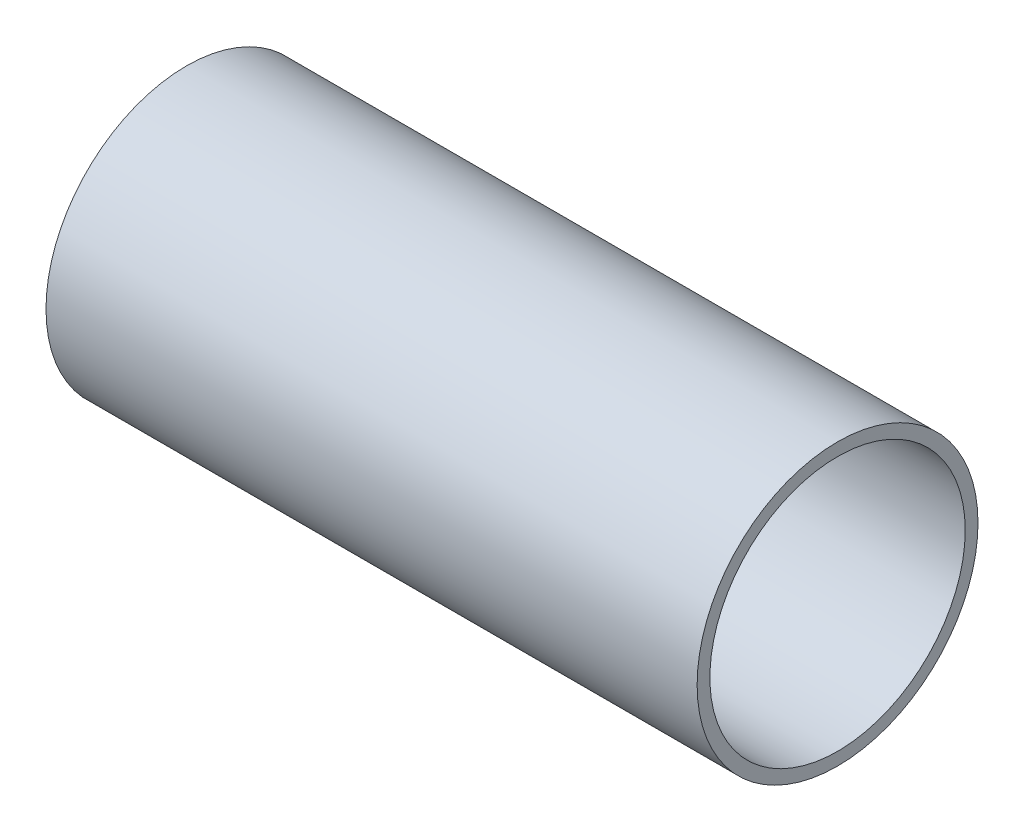
ISO-10303-21;
HEADER;
FILE_DESCRIPTION(('STEP AP214'),'2;1');
FILE_NAME('part.step','',(''),(''),'','','');
FILE_SCHEMA(('AUTOMOTIVE_DESIGN { 1 0 10303 214 1 1 1 1 }'));
ENDSEC;
DATA;
#1=APPLICATION_CONTEXT('core data for automotive mechanical design processes');
#2=APPLICATION_PROTOCOL_DEFINITION('international standard','automotive_design',2000,#1);
#3=PRODUCT_CONTEXT('',#1,'mechanical');
#4=PRODUCT('Part','Part','',(#3));
#5=PRODUCT_RELATED_PRODUCT_CATEGORY('part','',(#4));
#6=PRODUCT_DEFINITION_FORMATION('','',#4);
#7=PRODUCT_DEFINITION_CONTEXT('part definition',#1,'design');
#8=PRODUCT_DEFINITION('design','',#6,#7);
#9=PRODUCT_DEFINITION_SHAPE('','',#8);
#10=(LENGTH_UNIT() NAMED_UNIT(*) SI_UNIT(.MILLI.,.METRE.));
#11=(NAMED_UNIT(*) PLANE_ANGLE_UNIT() SI_UNIT($,.RADIAN.));
#12=(NAMED_UNIT(*) SI_UNIT($,.STERADIAN.) SOLID_ANGLE_UNIT());
#13=UNCERTAINTY_MEASURE_WITH_UNIT(LENGTH_MEASURE(1.E-05),#10,'distance_accuracy_value','');
#14=(GEOMETRIC_REPRESENTATION_CONTEXT(3) GLOBAL_UNCERTAINTY_ASSIGNED_CONTEXT((#13)) GLOBAL_UNIT_ASSIGNED_CONTEXT((#10,
#11,#12)) REPRESENTATION_CONTEXT('',''));
#15=CARTESIAN_POINT('',(0.,0.,0.));
#16=DIRECTION('',(0.,0.,1.));
#17=DIRECTION('',(1.,0.,0.));
#18=AXIS2_PLACEMENT_3D('',#15,#16,#17);
#19=CARTESIAN_POINT('',(102.,0.,0.));
#20=DIRECTION('',(1.,0.,0.));
#21=DIRECTION('',(0.,0.,-1.));
#22=AXIS2_PLACEMENT_3D('',#19,#20,#21);
#23=PLANE('',#22);
#24=CARTESIAN_POINT('',(102.,0.,0.));
#25=DIRECTION('',(1.,0.,0.));
#26=DIRECTION('',(0.,0.,-1.));
#27=AXIS2_PLACEMENT_3D('',#24,#25,#26);
#28=CIRCLE('',#27,22.);
#29=CARTESIAN_POINT('',(102.,0.,-22.));
#30=VERTEX_POINT('',#29);
#31=EDGE_CURVE('E10',#30,#30,#28,.T.);
#32=ORIENTED_EDGE('',*,*,#31,.T.);
#33=EDGE_LOOP('',(#32));
#34=FACE_BOUND('',#33,.T.);
#35=CARTESIAN_POINT('',(102.,0.,0.));
#36=DIRECTION('',(1.,0.,0.));
#37=DIRECTION('',(0.,0.,-1.));
#38=AXIS2_PLACEMENT_3D('',#35,#36,#37);
#39=CIRCLE('',#38,20.);
#40=CARTESIAN_POINT('',(102.,0.,-20.));
#41=VERTEX_POINT('',#40);
#42=EDGE_CURVE('E46',#41,#41,#39,.T.);
#43=ORIENTED_EDGE('',*,*,#42,.F.);
#44=EDGE_LOOP('',(#43));
#45=FACE_BOUND('',#44,.T.);
#46=ADVANCED_FACE('F35',(#34,#45),#23,.T.);
#47=CARTESIAN_POINT('',(0.,0.,0.));
#48=DIRECTION('',(1.,0.,0.));
#49=DIRECTION('',(0.,0.,-1.));
#50=AXIS2_PLACEMENT_3D('',#47,#48,#49);
#51=PLANE('',#50);
#52=CARTESIAN_POINT('',(0.,0.,0.));
#53=DIRECTION('',(1.,0.,0.));
#54=DIRECTION('',(0.,0.,-1.));
#55=AXIS2_PLACEMENT_3D('',#52,#53,#54);
#56=CIRCLE('',#55,22.);
#57=CARTESIAN_POINT('',(0.,0.,-22.));
#58=VERTEX_POINT('',#57);
#59=EDGE_CURVE('E39',#58,#58,#56,.T.);
#60=ORIENTED_EDGE('',*,*,#59,.F.);
#61=EDGE_LOOP('',(#60));
#62=FACE_BOUND('',#61,.T.);
#63=CARTESIAN_POINT('',(0.,0.,0.));
#64=DIRECTION('',(1.,0.,0.));
#65=DIRECTION('',(0.,0.,-1.));
#66=AXIS2_PLACEMENT_3D('',#63,#64,#65);
#67=CIRCLE('',#66,20.);
#68=CARTESIAN_POINT('',(0.,0.,-20.));
#69=VERTEX_POINT('',#68);
#70=EDGE_CURVE('E48',#69,#69,#67,.T.);
#71=ORIENTED_EDGE('',*,*,#70,.T.);
#72=EDGE_LOOP('',(#71));
#73=FACE_BOUND('',#72,.T.);
#74=ADVANCED_FACE('F58',(#62,#73),#51,.F.);
#75=CARTESIAN_POINT('',(102.,0.,0.));
#76=DIRECTION('',(-1.,0.,0.));
#77=DIRECTION('',(0.,0.,1.));
#78=AXIS2_PLACEMENT_3D('',#75,#76,#77);
#79=CYLINDRICAL_SURFACE('',#78,22.);
#80=ORIENTED_EDGE('',*,*,#31,.F.);
#81=EDGE_LOOP('',(#80));
#82=FACE_BOUND('',#81,.T.);
#83=ORIENTED_EDGE('',*,*,#59,.T.);
#84=EDGE_LOOP('',(#83));
#85=FACE_BOUND('',#84,.T.);
#86=ADVANCED_FACE('F37',(#82,#85),#79,.T.);
#87=CARTESIAN_POINT('',(102.,0.,0.));
#88=DIRECTION('',(-1.,0.,0.));
#89=DIRECTION('',(0.,0.,1.));
#90=AXIS2_PLACEMENT_3D('',#87,#88,#89);
#91=CYLINDRICAL_SURFACE('',#90,20.);
#92=ORIENTED_EDGE('',*,*,#42,.T.);
#93=EDGE_LOOP('',(#92));
#94=FACE_BOUND('',#93,.T.);
#95=ORIENTED_EDGE('',*,*,#70,.F.);
#96=EDGE_LOOP('',(#95));
#97=FACE_BOUND('',#96,.T.);
#98=ADVANCED_FACE('F54',(#94,#97),#91,.F.);
#99=CLOSED_SHELL('',(#46,#74,#86,#98));
#100=MANIFOLD_SOLID_BREP('B2',#99);
#101=ADVANCED_BREP_SHAPE_REPRESENTATION('',(#18,#100),#14);
#102=SHAPE_DEFINITION_REPRESENTATION(#9,#101);
ENDSEC;
END-ISO-10303-21;
